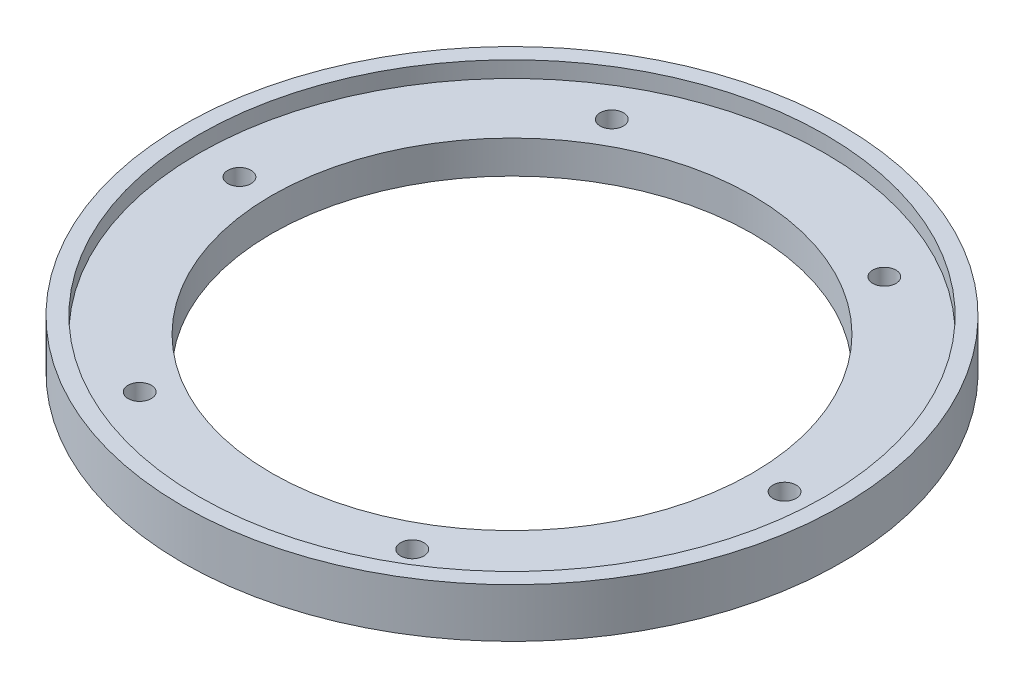
ISO-10303-21;
HEADER;
FILE_DESCRIPTION(('STEP AP214'),'2;1');
FILE_NAME('part.step','',(''),(''),'','','');
FILE_SCHEMA(('AUTOMOTIVE_DESIGN { 1 0 10303 214 1 1 1 1 }'));
ENDSEC;
DATA;
#1=APPLICATION_CONTEXT('core data for automotive mechanical design processes');
#2=APPLICATION_PROTOCOL_DEFINITION('international standard','automotive_design',2000,#1);
#3=PRODUCT_CONTEXT('',#1,'mechanical');
#4=PRODUCT('Part','Part','',(#3));
#5=PRODUCT_RELATED_PRODUCT_CATEGORY('part','',(#4));
#6=PRODUCT_DEFINITION_FORMATION('','',#4);
#7=PRODUCT_DEFINITION_CONTEXT('part definition',#1,'design');
#8=PRODUCT_DEFINITION('design','',#6,#7);
#9=PRODUCT_DEFINITION_SHAPE('','',#8);
#10=(LENGTH_UNIT() NAMED_UNIT(*) SI_UNIT(.MILLI.,.METRE.));
#11=(NAMED_UNIT(*) PLANE_ANGLE_UNIT() SI_UNIT($,.RADIAN.));
#12=(NAMED_UNIT(*) SI_UNIT($,.STERADIAN.) SOLID_ANGLE_UNIT());
#13=UNCERTAINTY_MEASURE_WITH_UNIT(LENGTH_MEASURE(1.E-05),#10,'distance_accuracy_value','');
#14=(GEOMETRIC_REPRESENTATION_CONTEXT(3) GLOBAL_UNCERTAINTY_ASSIGNED_CONTEXT((#13)) GLOBAL_UNIT_ASSIGNED_CONTEXT((#10,
#11,#12)) REPRESENTATION_CONTEXT('',''));
#15=CARTESIAN_POINT('',(0.,0.,0.));
#16=DIRECTION('',(0.,0.,1.));
#17=DIRECTION('',(1.,0.,0.));
#18=AXIS2_PLACEMENT_3D('',#15,#16,#17);
#19=CARTESIAN_POINT('',(0.,0.,0.));
#20=DIRECTION('',(0.,-1.,0.));
#21=DIRECTION('',(0.,0.,-1.));
#22=AXIS2_PLACEMENT_3D('',#19,#20,#21);
#23=CYLINDRICAL_SURFACE('',#22,44.5);
#24=CARTESIAN_POINT('',(0.,0.,0.));
#25=DIRECTION('',(0.,-1.,0.));
#26=DIRECTION('',(0.,0.,-1.));
#27=AXIS2_PLACEMENT_3D('',#24,#25,#26);
#28=CIRCLE('',#27,44.5);
#29=CARTESIAN_POINT('',(0.,0.,-44.5));
#30=VERTEX_POINT('',#29);
#31=EDGE_CURVE('E72',#30,#30,#28,.T.);
#32=ORIENTED_EDGE('',*,*,#31,.T.);
#33=EDGE_LOOP('',(#32));
#34=FACE_BOUND('',#33,.T.);
#35=CARTESIAN_POINT('',(0.,6.1,0.));
#36=DIRECTION('',(0.,-1.,0.));
#37=DIRECTION('',(0.,0.,-1.));
#38=AXIS2_PLACEMENT_3D('',#35,#36,#37);
#39=CIRCLE('',#38,44.5);
#40=CARTESIAN_POINT('',(0.,6.1,-44.5));
#41=VERTEX_POINT('',#40);
#42=EDGE_CURVE('E10',#41,#41,#39,.T.);
#43=ORIENTED_EDGE('',*,*,#42,.F.);
#44=EDGE_LOOP('',(#43));
#45=FACE_BOUND('',#44,.T.);
#46=ADVANCED_FACE('F39',(#34,#45),#23,.F.);
#47=CARTESIAN_POINT('',(44.5,6.1,0.));
#48=DIRECTION('',(0.,1.,0.));
#49=DIRECTION('',(0.,0.,1.));
#50=AXIS2_PLACEMENT_3D('',#47,#48,#49);
#51=PLANE('',#50);
#52=CARTESIAN_POINT('',(-50.45,6.1,0.));
#53=DIRECTION('',(0.,1.,0.));
#54=DIRECTION('',(0.,0.,1.));
#55=AXIS2_PLACEMENT_3D('',#52,#53,#54);
#56=CIRCLE('',#55,2.15);
#57=CARTESIAN_POINT('',(-50.45,6.1,2.15));
#58=VERTEX_POINT('',#57);
#59=EDGE_CURVE('E59',#58,#58,#56,.T.);
#60=ORIENTED_EDGE('',*,*,#59,.F.);
#61=EDGE_LOOP('',(#60));
#62=FACE_BOUND('',#61,.T.);
#63=CARTESIAN_POINT('',(-25.225,6.1,43.6909816209249));
#64=DIRECTION('',(0.,1.,0.));
#65=DIRECTION('',(0.,0.,1.));
#66=AXIS2_PLACEMENT_3D('',#63,#64,#65);
#67=CIRCLE('',#66,2.15);
#68=CARTESIAN_POINT('',(-25.225,6.1,45.8409816209249));
#69=VERTEX_POINT('',#68);
#70=EDGE_CURVE('E219',#69,#69,#67,.T.);
#71=ORIENTED_EDGE('',*,*,#70,.F.);
#72=EDGE_LOOP('',(#71));
#73=FACE_BOUND('',#72,.T.);
#74=CARTESIAN_POINT('',(25.225,6.1,43.6909816209249));
#75=DIRECTION('',(0.,1.,0.));
#76=DIRECTION('',(0.,0.,1.));
#77=AXIS2_PLACEMENT_3D('',#74,#75,#76);
#78=CIRCLE('',#77,2.15);
#79=CARTESIAN_POINT('',(25.225,6.1,45.8409816209249));
#80=VERTEX_POINT('',#79);
#81=EDGE_CURVE('E84',#80,#80,#78,.T.);
#82=ORIENTED_EDGE('',*,*,#81,.F.);
#83=EDGE_LOOP('',(#82));
#84=FACE_BOUND('',#83,.T.);
#85=CARTESIAN_POINT('',(50.45,6.1,0.));
#86=DIRECTION('',(0.,1.,0.));
#87=DIRECTION('',(0.,0.,1.));
#88=AXIS2_PLACEMENT_3D('',#85,#86,#87);
#89=CIRCLE('',#88,2.15);
#90=CARTESIAN_POINT('',(50.45,6.1,2.15));
#91=VERTEX_POINT('',#90);
#92=EDGE_CURVE('E223',#91,#91,#89,.T.);
#93=ORIENTED_EDGE('',*,*,#92,.F.);
#94=EDGE_LOOP('',(#93));
#95=FACE_BOUND('',#94,.T.);
#96=CARTESIAN_POINT('',(25.225,6.1,-43.6909816209249));
#97=DIRECTION('',(0.,1.,0.));
#98=DIRECTION('',(0.,0.,1.));
#99=AXIS2_PLACEMENT_3D('',#96,#97,#98);
#100=CIRCLE('',#99,2.15);
#101=CARTESIAN_POINT('',(25.225,6.1,-41.5409816209249));
#102=VERTEX_POINT('',#101);
#103=EDGE_CURVE('E216',#102,#102,#100,.T.);
#104=ORIENTED_EDGE('',*,*,#103,.F.);
#105=EDGE_LOOP('',(#104));
#106=FACE_BOUND('',#105,.T.);
#107=CARTESIAN_POINT('',(-25.225,6.1,-43.6909816209249));
#108=DIRECTION('',(0.,1.,0.));
#109=DIRECTION('',(0.,0.,1.));
#110=AXIS2_PLACEMENT_3D('',#107,#108,#109);
#111=CIRCLE('',#110,2.15);
#112=CARTESIAN_POINT('',(-25.225,6.1,-41.5409816209249));
#113=VERTEX_POINT('',#112);
#114=EDGE_CURVE('E213',#113,#113,#111,.T.);
#115=ORIENTED_EDGE('',*,*,#114,.F.);
#116=EDGE_LOOP('',(#115));
#117=FACE_BOUND('',#116,.T.);
#118=ORIENTED_EDGE('',*,*,#42,.T.);
#119=EDGE_LOOP('',(#118));
#120=FACE_BOUND('',#119,.T.);
#121=CARTESIAN_POINT('',(0.,6.1,0.));
#122=DIRECTION('',(0.,-1.,0.));
#123=DIRECTION('',(0.,0.,-1.));
#124=AXIS2_PLACEMENT_3D('',#121,#122,#123);
#125=CIRCLE('',#124,58.);
#126=CARTESIAN_POINT('',(0.,6.1,-58.));
#127=VERTEX_POINT('',#126);
#128=EDGE_CURVE('E46',#127,#127,#125,.T.);
#129=ORIENTED_EDGE('',*,*,#128,.F.);
#130=EDGE_LOOP('',(#129));
#131=FACE_BOUND('',#130,.T.);
#132=ADVANCED_FACE('F96',(#62,#73,#84,#95,#106,#117,#120,#131),#51,.T.);
#133=CARTESIAN_POINT('',(0.,0.,0.));
#134=DIRECTION('',(0.,-1.,0.));
#135=DIRECTION('',(0.,0.,-1.));
#136=AXIS2_PLACEMENT_3D('',#133,#134,#135);
#137=CYLINDRICAL_SURFACE('',#136,58.);
#138=ORIENTED_EDGE('',*,*,#128,.T.);
#139=EDGE_LOOP('',(#138));
#140=FACE_BOUND('',#139,.T.);
#141=CARTESIAN_POINT('',(0.,9.1,0.));
#142=DIRECTION('',(0.,-1.,0.));
#143=DIRECTION('',(0.,0.,-1.));
#144=AXIS2_PLACEMENT_3D('',#141,#142,#143);
#145=CIRCLE('',#144,58.);
#146=CARTESIAN_POINT('',(0.,9.1,-58.));
#147=VERTEX_POINT('',#146);
#148=EDGE_CURVE('E51',#147,#147,#145,.T.);
#149=ORIENTED_EDGE('',*,*,#148,.F.);
#150=EDGE_LOOP('',(#149));
#151=FACE_BOUND('',#150,.T.);
#152=ADVANCED_FACE('F94',(#140,#151),#137,.F.);
#153=CARTESIAN_POINT('',(58.,9.1,0.));
#154=DIRECTION('',(0.,1.,0.));
#155=DIRECTION('',(0.,0.,1.));
#156=AXIS2_PLACEMENT_3D('',#153,#154,#155);
#157=PLANE('',#156);
#158=ORIENTED_EDGE('',*,*,#148,.T.);
#159=EDGE_LOOP('',(#158));
#160=FACE_BOUND('',#159,.T.);
#161=CARTESIAN_POINT('',(0.,9.1,0.));
#162=DIRECTION('',(0.,-1.,0.));
#163=DIRECTION('',(0.,0.,-1.));
#164=AXIS2_PLACEMENT_3D('',#161,#162,#163);
#165=CIRCLE('',#164,61.);
#166=CARTESIAN_POINT('',(0.,9.1,-61.));
#167=VERTEX_POINT('',#166);
#168=EDGE_CURVE('E81',#167,#167,#165,.T.);
#169=ORIENTED_EDGE('',*,*,#168,.F.);
#170=EDGE_LOOP('',(#169));
#171=FACE_BOUND('',#170,.T.);
#172=ADVANCED_FACE('F91',(#160,#171),#157,.T.);
#173=CARTESIAN_POINT('',(0.,0.,0.));
#174=DIRECTION('',(0.,-1.,0.));
#175=DIRECTION('',(0.,0.,-1.));
#176=AXIS2_PLACEMENT_3D('',#173,#174,#175);
#177=CYLINDRICAL_SURFACE('',#176,61.);
#178=ORIENTED_EDGE('',*,*,#168,.T.);
#179=EDGE_LOOP('',(#178));
#180=FACE_BOUND('',#179,.T.);
#181=CARTESIAN_POINT('',(0.,0.,0.));
#182=DIRECTION('',(0.,-1.,0.));
#183=DIRECTION('',(0.,0.,-1.));
#184=AXIS2_PLACEMENT_3D('',#181,#182,#183);
#185=CIRCLE('',#184,61.);
#186=CARTESIAN_POINT('',(0.,0.,-61.));
#187=VERTEX_POINT('',#186);
#188=EDGE_CURVE('E76',#187,#187,#185,.T.);
#189=ORIENTED_EDGE('',*,*,#188,.F.);
#190=EDGE_LOOP('',(#189));
#191=FACE_BOUND('',#190,.T.);
#192=ADVANCED_FACE('F103',(#180,#191),#177,.T.);
#193=CARTESIAN_POINT('',(44.5,0.,0.));
#194=DIRECTION('',(0.,-1.,0.));
#195=DIRECTION('',(0.,0.,-1.));
#196=AXIS2_PLACEMENT_3D('',#193,#194,#195);
#197=PLANE('',#196);
#198=CARTESIAN_POINT('',(-50.45,0.,0.));
#199=DIRECTION('',(0.,-1.,0.));
#200=DIRECTION('',(0.,0.,-1.));
#201=AXIS2_PLACEMENT_3D('',#198,#199,#200);
#202=CIRCLE('',#201,2.15);
#203=CARTESIAN_POINT('',(-50.45,0.,-2.15));
#204=VERTEX_POINT('',#203);
#205=EDGE_CURVE('E42',#204,#204,#202,.T.);
#206=ORIENTED_EDGE('',*,*,#205,.F.);
#207=EDGE_LOOP('',(#206));
#208=FACE_BOUND('',#207,.T.);
#209=CARTESIAN_POINT('',(-25.225,0.,43.6909816209249));
#210=DIRECTION('',(0.,-1.,0.));
#211=DIRECTION('',(0.,0.,-1.));
#212=AXIS2_PLACEMENT_3D('',#209,#210,#211);
#213=CIRCLE('',#212,2.15);
#214=CARTESIAN_POINT('',(-25.225,0.,41.5409816209249));
#215=VERTEX_POINT('',#214);
#216=EDGE_CURVE('E67',#215,#215,#213,.T.);
#217=ORIENTED_EDGE('',*,*,#216,.F.);
#218=EDGE_LOOP('',(#217));
#219=FACE_BOUND('',#218,.T.);
#220=CARTESIAN_POINT('',(25.225,0.,43.6909816209249));
#221=DIRECTION('',(0.,-1.,0.));
#222=DIRECTION('',(0.,0.,-1.));
#223=AXIS2_PLACEMENT_3D('',#220,#221,#222);
#224=CIRCLE('',#223,2.15);
#225=CARTESIAN_POINT('',(25.225,0.,41.5409816209249));
#226=VERTEX_POINT('',#225);
#227=EDGE_CURVE('E65',#226,#226,#224,.T.);
#228=ORIENTED_EDGE('',*,*,#227,.F.);
#229=EDGE_LOOP('',(#228));
#230=FACE_BOUND('',#229,.T.);
#231=CARTESIAN_POINT('',(50.45,0.,0.));
#232=DIRECTION('',(0.,-1.,0.));
#233=DIRECTION('',(0.,0.,-1.));
#234=AXIS2_PLACEMENT_3D('',#231,#232,#233);
#235=CIRCLE('',#234,2.15);
#236=CARTESIAN_POINT('',(50.45,0.,-2.15000000000001));
#237=VERTEX_POINT('',#236);
#238=EDGE_CURVE('E62',#237,#237,#235,.T.);
#239=ORIENTED_EDGE('',*,*,#238,.F.);
#240=EDGE_LOOP('',(#239));
#241=FACE_BOUND('',#240,.T.);
#242=CARTESIAN_POINT('',(25.225,0.,-43.6909816209249));
#243=DIRECTION('',(0.,-1.,0.));
#244=DIRECTION('',(0.,0.,-1.));
#245=AXIS2_PLACEMENT_3D('',#242,#243,#244);
#246=CIRCLE('',#245,2.15);
#247=CARTESIAN_POINT('',(25.225,0.,-45.8409816209249));
#248=VERTEX_POINT('',#247);
#249=EDGE_CURVE('E58',#248,#248,#246,.T.);
#250=ORIENTED_EDGE('',*,*,#249,.F.);
#251=EDGE_LOOP('',(#250));
#252=FACE_BOUND('',#251,.T.);
#253=CARTESIAN_POINT('',(-25.225,0.,-43.6909816209249));
#254=DIRECTION('',(0.,-1.,0.));
#255=DIRECTION('',(0.,0.,-1.));
#256=AXIS2_PLACEMENT_3D('',#253,#254,#255);
#257=CIRCLE('',#256,2.15);
#258=CARTESIAN_POINT('',(-25.225,0.,-45.8409816209249));
#259=VERTEX_POINT('',#258);
#260=EDGE_CURVE('E55',#259,#259,#257,.T.);
#261=ORIENTED_EDGE('',*,*,#260,.F.);
#262=EDGE_LOOP('',(#261));
#263=FACE_BOUND('',#262,.T.);
#264=ORIENTED_EDGE('',*,*,#188,.T.);
#265=EDGE_LOOP('',(#264));
#266=FACE_BOUND('',#265,.T.);
#267=ORIENTED_EDGE('',*,*,#31,.F.);
#268=EDGE_LOOP('',(#267));
#269=FACE_BOUND('',#268,.T.);
#270=ADVANCED_FACE('F137',(#208,#219,#230,#241,#252,#263,#266,#269),#197,.T.);
#271=CARTESIAN_POINT('',(-25.225,-3.9,-43.6909816209249));
#272=DIRECTION('',(0.,1.,0.));
#273=DIRECTION('',(0.,0.,1.));
#274=AXIS2_PLACEMENT_3D('',#271,#272,#273);
#275=CYLINDRICAL_SURFACE('',#274,2.15);
#276=ORIENTED_EDGE('',*,*,#260,.T.);
#277=EDGE_LOOP('',(#276));
#278=FACE_BOUND('',#277,.T.);
#279=ORIENTED_EDGE('',*,*,#114,.T.);
#280=EDGE_LOOP('',(#279));
#281=FACE_BOUND('',#280,.T.);
#282=ADVANCED_FACE('F146',(#278,#281),#275,.F.);
#283=CARTESIAN_POINT('',(25.225,-3.9,-43.6909816209249));
#284=DIRECTION('',(0.,1.,0.));
#285=DIRECTION('',(0.,0.,1.));
#286=AXIS2_PLACEMENT_3D('',#283,#284,#285);
#287=CYLINDRICAL_SURFACE('',#286,2.15);
#288=ORIENTED_EDGE('',*,*,#249,.T.);
#289=EDGE_LOOP('',(#288));
#290=FACE_BOUND('',#289,.T.);
#291=ORIENTED_EDGE('',*,*,#103,.T.);
#292=EDGE_LOOP('',(#291));
#293=FACE_BOUND('',#292,.T.);
#294=ADVANCED_FACE('F159',(#290,#293),#287,.F.);
#295=CARTESIAN_POINT('',(50.45,-3.9,0.));
#296=DIRECTION('',(0.,1.,0.));
#297=DIRECTION('',(0.,0.,1.));
#298=AXIS2_PLACEMENT_3D('',#295,#296,#297);
#299=CYLINDRICAL_SURFACE('',#298,2.15);
#300=ORIENTED_EDGE('',*,*,#238,.T.);
#301=EDGE_LOOP('',(#300));
#302=FACE_BOUND('',#301,.T.);
#303=ORIENTED_EDGE('',*,*,#92,.T.);
#304=EDGE_LOOP('',(#303));
#305=FACE_BOUND('',#304,.T.);
#306=ADVANCED_FACE('F169',(#302,#305),#299,.F.);
#307=CARTESIAN_POINT('',(25.225,-3.9,43.6909816209249));
#308=DIRECTION('',(0.,1.,0.));
#309=DIRECTION('',(0.,0.,1.));
#310=AXIS2_PLACEMENT_3D('',#307,#308,#309);
#311=CYLINDRICAL_SURFACE('',#310,2.15);
#312=ORIENTED_EDGE('',*,*,#227,.T.);
#313=EDGE_LOOP('',(#312));
#314=FACE_BOUND('',#313,.T.);
#315=ORIENTED_EDGE('',*,*,#81,.T.);
#316=EDGE_LOOP('',(#315));
#317=FACE_BOUND('',#316,.T.);
#318=ADVANCED_FACE('F179',(#314,#317),#311,.F.);
#319=CARTESIAN_POINT('',(-25.225,-3.9,43.6909816209249));
#320=DIRECTION('',(0.,1.,0.));
#321=DIRECTION('',(0.,0.,1.));
#322=AXIS2_PLACEMENT_3D('',#319,#320,#321);
#323=CYLINDRICAL_SURFACE('',#322,2.15);
#324=ORIENTED_EDGE('',*,*,#216,.T.);
#325=EDGE_LOOP('',(#324));
#326=FACE_BOUND('',#325,.T.);
#327=ORIENTED_EDGE('',*,*,#70,.T.);
#328=EDGE_LOOP('',(#327));
#329=FACE_BOUND('',#328,.T.);
#330=ADVANCED_FACE('F189',(#326,#329),#323,.F.);
#331=CARTESIAN_POINT('',(-50.45,-3.9,0.));
#332=DIRECTION('',(0.,1.,0.));
#333=DIRECTION('',(0.,0.,1.));
#334=AXIS2_PLACEMENT_3D('',#331,#332,#333);
#335=CYLINDRICAL_SURFACE('',#334,2.15);
#336=ORIENTED_EDGE('',*,*,#205,.T.);
#337=EDGE_LOOP('',(#336));
#338=FACE_BOUND('',#337,.T.);
#339=ORIENTED_EDGE('',*,*,#59,.T.);
#340=EDGE_LOOP('',(#339));
#341=FACE_BOUND('',#340,.T.);
#342=ADVANCED_FACE('F199',(#338,#341),#335,.F.);
#343=CLOSED_SHELL('',(#46,#132,#152,#172,#192,#270,#282,#294,#306,#318,#330,#342));
#344=MANIFOLD_SOLID_BREP('B2',#343);
#345=ADVANCED_BREP_SHAPE_REPRESENTATION('',(#18,#344),#14);
#346=SHAPE_DEFINITION_REPRESENTATION(#9,#345);
ENDSEC;
END-ISO-10303-21;
